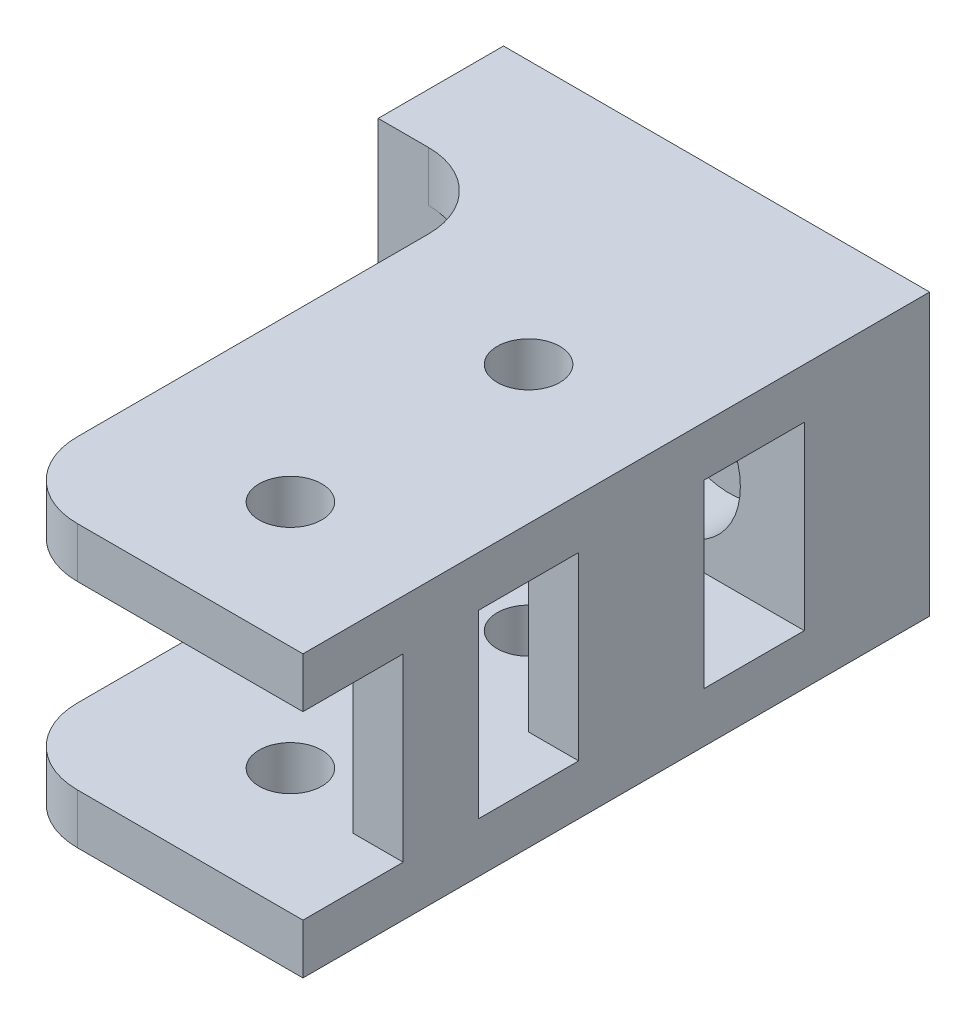
ISO-10303-21;
HEADER;
FILE_DESCRIPTION(('STEP AP214'),'2;1');
FILE_NAME('part.step','',(''),(''),'','','');
FILE_SCHEMA(('AUTOMOTIVE_DESIGN { 1 0 10303 214 1 1 1 1 }'));
ENDSEC;
DATA;
#1=APPLICATION_CONTEXT('core data for automotive mechanical design processes');
#2=APPLICATION_PROTOCOL_DEFINITION('international standard','automotive_design',2000,#1);
#3=PRODUCT_CONTEXT('',#1,'mechanical');
#4=PRODUCT('Part','Part','',(#3));
#5=PRODUCT_RELATED_PRODUCT_CATEGORY('part','',(#4));
#6=PRODUCT_DEFINITION_FORMATION('','',#4);
#7=PRODUCT_DEFINITION_CONTEXT('part definition',#1,'design');
#8=PRODUCT_DEFINITION('design','',#6,#7);
#9=PRODUCT_DEFINITION_SHAPE('','',#8);
#10=(LENGTH_UNIT() NAMED_UNIT(*) SI_UNIT(.MILLI.,.METRE.));
#11=(NAMED_UNIT(*) PLANE_ANGLE_UNIT() SI_UNIT($,.RADIAN.));
#12=(NAMED_UNIT(*) SI_UNIT($,.STERADIAN.) SOLID_ANGLE_UNIT());
#13=UNCERTAINTY_MEASURE_WITH_UNIT(LENGTH_MEASURE(1.E-05),#10,'distance_accuracy_value','');
#14=(GEOMETRIC_REPRESENTATION_CONTEXT(3) GLOBAL_UNCERTAINTY_ASSIGNED_CONTEXT((#13)) GLOBAL_UNIT_ASSIGNED_CONTEXT((#10,
#11,#12)) REPRESENTATION_CONTEXT('',''));
#15=CARTESIAN_POINT('',(0.,0.,0.));
#16=DIRECTION('',(0.,0.,1.));
#17=DIRECTION('',(1.,0.,0.));
#18=AXIS2_PLACEMENT_3D('',#15,#16,#17);
#19=CARTESIAN_POINT('',(11.4991666087883,-5.5,5.));
#20=DIRECTION('',(0.,0.,-1.));
#21=DIRECTION('',(-1.,0.,0.));
#22=AXIS2_PLACEMENT_3D('',#19,#20,#21);
#23=CYLINDRICAL_SURFACE('',#22,1.75);
#24=CARTESIAN_POINT('',(11.4991666087883,-5.5,0.));
#25=DIRECTION('',(0.,0.,1.));
#26=DIRECTION('',(1.,0.,0.));
#27=AXIS2_PLACEMENT_3D('',#24,#25,#26);
#28=CIRCLE('',#27,1.75);
#29=CARTESIAN_POINT('',(13.2491666087883,-5.5,0.));
#30=VERTEX_POINT('',#29);
#31=EDGE_CURVE('E382',#30,#30,#28,.T.);
#32=ORIENTED_EDGE('',*,*,#31,.F.);
#33=EDGE_LOOP('',(#32));
#34=FACE_BOUND('',#33,.T.);
#35=CARTESIAN_POINT('',(11.4991666087883,-5.5,2.5));
#36=DIRECTION('',(0.,0.,1.));
#37=DIRECTION('',(1.,0.,0.));
#38=AXIS2_PLACEMENT_3D('',#35,#36,#37);
#39=CIRCLE('',#38,1.75);
#40=CARTESIAN_POINT('',(13.2491666087883,-5.5,2.5));
#41=VERTEX_POINT('',#40);
#42=EDGE_CURVE('E234',#41,#41,#39,.T.);
#43=ORIENTED_EDGE('',*,*,#42,.T.);
#44=EDGE_LOOP('',(#43));
#45=FACE_BOUND('',#44,.T.);
#46=ADVANCED_FACE('F37',(#34,#45),#23,.F.);
#47=CARTESIAN_POINT('',(5.5,-5.6,5.));
#48=DIRECTION('',(0.,0.,-1.));
#49=DIRECTION('',(-1.,0.,0.));
#50=AXIS2_PLACEMENT_3D('',#47,#48,#49);
#51=CYLINDRICAL_SURFACE('',#50,1.75);
#52=CARTESIAN_POINT('',(5.5,-5.6,0.));
#53=DIRECTION('',(0.,0.,1.));
#54=DIRECTION('',(1.,0.,0.));
#55=AXIS2_PLACEMENT_3D('',#52,#53,#54);
#56=CIRCLE('',#55,1.75);
#57=CARTESIAN_POINT('',(7.25,-5.6,0.));
#58=VERTEX_POINT('',#57);
#59=EDGE_CURVE('E385',#58,#58,#56,.T.);
#60=ORIENTED_EDGE('',*,*,#59,.F.);
#61=EDGE_LOOP('',(#60));
#62=FACE_BOUND('',#61,.T.);
#63=CARTESIAN_POINT('',(5.5,-5.6,2.5));
#64=DIRECTION('',(0.,0.,1.));
#65=DIRECTION('',(1.,0.,0.));
#66=AXIS2_PLACEMENT_3D('',#63,#64,#65);
#67=CIRCLE('',#66,1.75);
#68=CARTESIAN_POINT('',(7.25,-5.6,2.5));
#69=VERTEX_POINT('',#68);
#70=EDGE_CURVE('E205',#69,#69,#67,.T.);
#71=ORIENTED_EDGE('',*,*,#70,.T.);
#72=EDGE_LOOP('',(#71));
#73=FACE_BOUND('',#72,.T.);
#74=ADVANCED_FACE('F471',(#62,#73),#51,.F.);
#75=CARTESIAN_POINT('',(14.9991666087883,0.,25.));
#76=DIRECTION('',(-1.,0.,0.));
#77=DIRECTION('',(0.,0.,1.));
#78=AXIS2_PLACEMENT_3D('',#75,#76,#77);
#79=PLANE('',#78);
#80=DIRECTION('',(0.,-1.,0.));
#81=VECTOR('',#80,1.);
#82=CARTESIAN_POINT('',(14.9991666087883,-2.,21.));
#83=LINE('',#82,#81);
#84=CARTESIAN_POINT('',(14.9991666087883,-2.,21.));
#85=VERTEX_POINT('',#84);
#86=CARTESIAN_POINT('',(14.9991666087883,-9.2,21.));
#87=VERTEX_POINT('',#86);
#88=EDGE_CURVE('E298',#85,#87,#83,.T.);
#89=ORIENTED_EDGE('',*,*,#88,.F.);
#90=DIRECTION('',(0.,0.,-1.));
#91=VECTOR('',#90,1.);
#92=CARTESIAN_POINT('',(14.9991666087883,-2.,25.));
#93=LINE('',#92,#91);
#94=CARTESIAN_POINT('',(14.9991666087883,-2.,18.));
#95=VERTEX_POINT('',#94);
#96=EDGE_CURVE('E381',#85,#95,#93,.T.);
#97=ORIENTED_EDGE('',*,*,#96,.T.);
#98=DIRECTION('',(0.,1.,0.));
#99=VECTOR('',#98,1.);
#100=CARTESIAN_POINT('',(14.9991666087883,-2.,18.));
#101=LINE('',#100,#99);
#102=CARTESIAN_POINT('',(14.9991666087883,-9.2,18.));
#103=VERTEX_POINT('',#102);
#104=EDGE_CURVE('E297',#103,#95,#101,.T.);
#105=ORIENTED_EDGE('',*,*,#104,.F.);
#106=DIRECTION('',(0.,0.,-1.));
#107=VECTOR('',#106,1.);
#108=CARTESIAN_POINT('',(14.9991666087883,-9.2,25.));
#109=LINE('',#108,#107);
#110=EDGE_CURVE('E378',#87,#103,#109,.T.);
#111=ORIENTED_EDGE('',*,*,#110,.F.);
#112=EDGE_LOOP('',(#89,#97,#105,#111));
#113=FACE_BOUND('',#112,.T.);
#114=ADVANCED_FACE('F477',(#113),#79,.T.);
#115=CARTESIAN_POINT('',(0.,0.,25.));
#116=DIRECTION('',(0.,0.,1.));
#117=DIRECTION('',(1.,0.,0.));
#118=AXIS2_PLACEMENT_3D('',#115,#116,#117);
#119=PLANE('',#118);
#120=DIRECTION('',(-1.,0.,0.));
#121=VECTOR('',#120,1.);
#122=CARTESIAN_POINT('',(0.,0.,25.));
#123=LINE('',#122,#121);
#124=CARTESIAN_POINT('',(16.9991666087883,0.,25.));
#125=VERTEX_POINT('',#124);
#126=CARTESIAN_POINT('',(7.99916660878826,0.,25.));
#127=VERTEX_POINT('',#126);
#128=EDGE_CURVE('E363',#125,#127,#123,.T.);
#129=ORIENTED_EDGE('',*,*,#128,.T.);
#130=DIRECTION('',(0.,-1.,0.));
#131=VECTOR('',#130,1.);
#132=CARTESIAN_POINT('',(7.99916660878826,-2.,25.));
#133=LINE('',#132,#131);
#134=CARTESIAN_POINT('',(7.99916660878826,-2.,25.));
#135=VERTEX_POINT('',#134);
#136=EDGE_CURVE('E211',#127,#135,#133,.T.);
#137=ORIENTED_EDGE('',*,*,#136,.T.);
#138=DIRECTION('',(1.,0.,0.));
#139=VECTOR('',#138,1.);
#140=CARTESIAN_POINT('',(0.,-2.,25.));
#141=LINE('',#140,#139);
#142=CARTESIAN_POINT('',(16.9991666087883,-2.,25.));
#143=VERTEX_POINT('',#142);
#144=EDGE_CURVE('E367',#135,#143,#141,.T.);
#145=ORIENTED_EDGE('',*,*,#144,.T.);
#146=DIRECTION('',(0.,1.,0.));
#147=VECTOR('',#146,1.);
#148=CARTESIAN_POINT('',(16.9991666087883,0.,25.));
#149=LINE('',#148,#147);
#150=EDGE_CURVE('E364',#143,#125,#149,.T.);
#151=ORIENTED_EDGE('',*,*,#150,.T.);
#152=EDGE_LOOP('',(#129,#137,#145,#151));
#153=FACE_BOUND('',#152,.T.);
#154=ADVANCED_FACE('F450',(#153),#119,.T.);
#155=CARTESIAN_POINT('',(0.,0.,5.));
#156=DIRECTION('',(0.,0.,1.));
#157=DIRECTION('',(1.,0.,0.));
#158=AXIS2_PLACEMENT_3D('',#155,#156,#157);
#159=PLANE('',#158);
#160=CARTESIAN_POINT('',(11.4991666087883,-5.5,5.));
#161=DIRECTION('',(0.,0.,1.));
#162=DIRECTION('',(1.,0.,0.));
#163=AXIS2_PLACEMENT_3D('',#160,#161,#162);
#164=CIRCLE('',#163,2.95);
#165=CARTESIAN_POINT('',(14.4491666087883,-5.5,5.));
#166=VERTEX_POINT('',#165);
#167=EDGE_CURVE('E433',#166,#166,#164,.T.);
#168=ORIENTED_EDGE('',*,*,#167,.F.);
#169=EDGE_LOOP('',(#168));
#170=FACE_BOUND('',#169,.T.);
#171=CARTESIAN_POINT('',(5.5,-5.6,5.));
#172=DIRECTION('',(0.,0.,1.));
#173=DIRECTION('',(1.,0.,0.));
#174=AXIS2_PLACEMENT_3D('',#171,#172,#173);
#175=CIRCLE('',#174,2.95);
#176=CARTESIAN_POINT('',(8.45,-5.6,5.));
#177=VERTEX_POINT('',#176);
#178=EDGE_CURVE('E236',#177,#177,#175,.T.);
#179=ORIENTED_EDGE('',*,*,#178,.F.);
#180=EDGE_LOOP('',(#179));
#181=FACE_BOUND('',#180,.T.);
#182=DIRECTION('',(1.,0.,0.));
#183=VECTOR('',#182,1.);
#184=CARTESIAN_POINT('',(0.,-11.2,5.));
#185=LINE('',#184,#183);
#186=CARTESIAN_POINT('',(0.,-11.2,5.));
#187=VERTEX_POINT('',#186);
#188=CARTESIAN_POINT('',(1.99916660878826,-11.2,5.));
#189=VERTEX_POINT('',#188);
#190=EDGE_CURVE('E187',#187,#189,#185,.T.);
#191=ORIENTED_EDGE('',*,*,#190,.T.);
#192=DIRECTION('',(0.,-1.,0.));
#193=VECTOR('',#192,1.);
#194=CARTESIAN_POINT('',(1.99916660878826,0.,5.));
#195=LINE('',#194,#193);
#196=CARTESIAN_POINT('',(1.99916660878826,-9.2,5.));
#197=VERTEX_POINT('',#196);
#198=EDGE_CURVE('E261',#189,#197,#195,.F.);
#199=ORIENTED_EDGE('',*,*,#198,.T.);
#200=DIRECTION('',(-1.,0.,0.));
#201=VECTOR('',#200,1.);
#202=CARTESIAN_POINT('',(0.,-9.2,5.));
#203=LINE('',#202,#201);
#204=CARTESIAN_POINT('',(16.9991666087883,-9.2,5.));
#205=VERTEX_POINT('',#204);
#206=EDGE_CURVE('E52',#205,#197,#203,.T.);
#207=ORIENTED_EDGE('',*,*,#206,.F.);
#208=DIRECTION('',(0.,-1.,0.));
#209=VECTOR('',#208,1.);
#210=CARTESIAN_POINT('',(16.9991666087883,0.,5.));
#211=LINE('',#210,#209);
#212=CARTESIAN_POINT('',(16.9991666087883,-2.,5.));
#213=VERTEX_POINT('',#212);
#214=EDGE_CURVE('E357',#213,#205,#211,.T.);
#215=ORIENTED_EDGE('',*,*,#214,.F.);
#216=DIRECTION('',(1.,0.,0.));
#217=VECTOR('',#216,1.);
#218=CARTESIAN_POINT('',(0.,-2.,5.));
#219=LINE('',#218,#217);
#220=CARTESIAN_POINT('',(1.99916660878826,-2.,5.));
#221=VERTEX_POINT('',#220);
#222=EDGE_CURVE('E60',#221,#213,#219,.T.);
#223=ORIENTED_EDGE('',*,*,#222,.F.);
#224=DIRECTION('',(0.,-1.,0.));
#225=VECTOR('',#224,1.);
#226=CARTESIAN_POINT('',(1.99916660878826,0.,5.));
#227=LINE('',#226,#225);
#228=CARTESIAN_POINT('',(1.99916660878826,0.,5.));
#229=VERTEX_POINT('',#228);
#230=EDGE_CURVE('E259',#221,#229,#227,.F.);
#231=ORIENTED_EDGE('',*,*,#230,.T.);
#232=DIRECTION('',(1.,0.,0.));
#233=VECTOR('',#232,1.);
#234=CARTESIAN_POINT('',(0.,0.,5.));
#235=LINE('',#234,#233);
#236=CARTESIAN_POINT('',(0.,0.,5.));
#237=VERTEX_POINT('',#236);
#238=EDGE_CURVE('E190',#237,#229,#235,.T.);
#239=ORIENTED_EDGE('',*,*,#238,.F.);
#240=DIRECTION('',(0.,-1.,0.));
#241=VECTOR('',#240,1.);
#242=CARTESIAN_POINT('',(0.,0.,5.));
#243=LINE('',#242,#241);
#244=EDGE_CURVE('E184',#237,#187,#243,.T.);
#245=ORIENTED_EDGE('',*,*,#244,.T.);
#246=EDGE_LOOP('',(#191,#199,#207,#215,#223,#231,#239,#245));
#247=FACE_BOUND('',#246,.T.);
#248=ADVANCED_FACE('F186',(#170,#181,#247),#159,.T.);
#249=CARTESIAN_POINT('',(0.,0.,0.));
#250=DIRECTION('',(0.,0.,1.));
#251=DIRECTION('',(1.,0.,0.));
#252=AXIS2_PLACEMENT_3D('',#249,#250,#251);
#253=PLANE('',#252);
#254=DIRECTION('',(0.,-1.,0.));
#255=VECTOR('',#254,1.);
#256=CARTESIAN_POINT('',(0.,0.,0.));
#257=LINE('',#256,#255);
#258=CARTESIAN_POINT('',(0.,0.,0.));
#259=VERTEX_POINT('',#258);
#260=CARTESIAN_POINT('',(0.,-11.2,0.));
#261=VERTEX_POINT('',#260);
#262=EDGE_CURVE('E210',#259,#261,#257,.T.);
#263=ORIENTED_EDGE('',*,*,#262,.F.);
#264=DIRECTION('',(-1.,0.,0.));
#265=VECTOR('',#264,1.);
#266=CARTESIAN_POINT('',(0.,0.,0.));
#267=LINE('',#266,#265);
#268=CARTESIAN_POINT('',(16.9991666087883,0.,0.));
#269=VERTEX_POINT('',#268);
#270=EDGE_CURVE('E195',#269,#259,#267,.T.);
#271=ORIENTED_EDGE('',*,*,#270,.F.);
#272=DIRECTION('',(0.,1.,0.));
#273=VECTOR('',#272,1.);
#274=CARTESIAN_POINT('',(16.9991666087883,0.,0.));
#275=LINE('',#274,#273);
#276=CARTESIAN_POINT('',(16.9991666087883,-11.2,0.));
#277=VERTEX_POINT('',#276);
#278=EDGE_CURVE('E391',#277,#269,#275,.T.);
#279=ORIENTED_EDGE('',*,*,#278,.F.);
#280=DIRECTION('',(1.,0.,0.));
#281=VECTOR('',#280,1.);
#282=CARTESIAN_POINT('',(0.,-11.2,0.));
#283=LINE('',#282,#281);
#284=EDGE_CURVE('E389',#261,#277,#283,.T.);
#285=ORIENTED_EDGE('',*,*,#284,.F.);
#286=EDGE_LOOP('',(#263,#271,#279,#285));
#287=FACE_BOUND('',#286,.T.);
#288=ORIENTED_EDGE('',*,*,#59,.T.);
#289=EDGE_LOOP('',(#288));
#290=FACE_BOUND('',#289,.T.);
#291=ORIENTED_EDGE('',*,*,#31,.T.);
#292=EDGE_LOOP('',(#291));
#293=FACE_BOUND('',#292,.T.);
#294=ADVANCED_FACE('F402',(#287,#290,#293),#253,.F.);
#295=CARTESIAN_POINT('',(0.,0.,5.));
#296=DIRECTION('',(1.,0.,0.));
#297=DIRECTION('',(0.,1.,0.));
#298=AXIS2_PLACEMENT_3D('',#295,#296,#297);
#299=PLANE('',#298);
#300=DIRECTION('',(0.,0.,-1.));
#301=VECTOR('',#300,1.);
#302=CARTESIAN_POINT('',(0.,-11.2,5.));
#303=LINE('',#302,#301);
#304=EDGE_CURVE('E200',#187,#261,#303,.T.);
#305=ORIENTED_EDGE('',*,*,#304,.F.);
#306=ORIENTED_EDGE('',*,*,#244,.F.);
#307=DIRECTION('',(0.,0.,-1.));
#308=VECTOR('',#307,1.);
#309=CARTESIAN_POINT('',(0.,0.,5.));
#310=LINE('',#309,#308);
#311=EDGE_CURVE('E194',#237,#259,#310,.T.);
#312=ORIENTED_EDGE('',*,*,#311,.T.);
#313=ORIENTED_EDGE('',*,*,#262,.T.);
#314=EDGE_LOOP('',(#305,#306,#312,#313));
#315=FACE_BOUND('',#314,.T.);
#316=ADVANCED_FACE('F208',(#315),#299,.F.);
#317=CARTESIAN_POINT('',(0.,-11.2,5.));
#318=DIRECTION('',(0.,1.,0.));
#319=DIRECTION('',(0.,0.,1.));
#320=AXIS2_PLACEMENT_3D('',#317,#318,#319);
#321=PLANE('',#320);
#322=CARTESIAN_POINT('',(11.4991666087883,-11.2,10.5));
#323=DIRECTION('',(0.,-1.,0.));
#324=DIRECTION('',(0.,0.,-1.));
#325=AXIS2_PLACEMENT_3D('',#322,#323,#324);
#326=CIRCLE('',#325,1.25);
#327=CARTESIAN_POINT('',(11.4991666087883,-11.2,9.25));
#328=VERTEX_POINT('',#327);
#329=EDGE_CURVE('E423',#328,#328,#326,.T.);
#330=ORIENTED_EDGE('',*,*,#329,.F.);
#331=EDGE_LOOP('',(#330));
#332=FACE_BOUND('',#331,.T.);
#333=CARTESIAN_POINT('',(11.4991666087883,-11.2,20.));
#334=DIRECTION('',(0.,-1.,0.));
#335=DIRECTION('',(0.,0.,-1.));
#336=AXIS2_PLACEMENT_3D('',#333,#334,#335);
#337=CIRCLE('',#336,1.25);
#338=CARTESIAN_POINT('',(11.4991666087883,-11.2,18.75));
#339=VERTEX_POINT('',#338);
#340=EDGE_CURVE('E226',#339,#339,#337,.T.);
#341=ORIENTED_EDGE('',*,*,#340,.F.);
#342=EDGE_LOOP('',(#341));
#343=FACE_BOUND('',#342,.T.);
#344=DIRECTION('',(1.,0.,0.));
#345=VECTOR('',#344,1.);
#346=CARTESIAN_POINT('',(0.,-11.2,25.));
#347=LINE('',#346,#345);
#348=CARTESIAN_POINT('',(7.99916660878826,-11.2,25.));
#349=VERTEX_POINT('',#348);
#350=CARTESIAN_POINT('',(16.9991666087883,-11.2,25.));
#351=VERTEX_POINT('',#350);
#352=EDGE_CURVE('E372',#349,#351,#347,.T.);
#353=ORIENTED_EDGE('',*,*,#352,.F.);
#354=CARTESIAN_POINT('',(7.99916660878826,-11.2,22.));
#355=DIRECTION('',(0.,1.,0.));
#356=DIRECTION('',(0.,0.,1.));
#357=AXIS2_PLACEMENT_3D('',#354,#355,#356);
#358=CIRCLE('',#357,3.);
#359=CARTESIAN_POINT('',(4.99916660878826,-11.2,22.));
#360=VERTEX_POINT('',#359);
#361=EDGE_CURVE('E257',#349,#360,#358,.F.);
#362=ORIENTED_EDGE('',*,*,#361,.T.);
#363=DIRECTION('',(0.,0.,1.));
#364=VECTOR('',#363,1.);
#365=CARTESIAN_POINT('',(4.99916660878826,-11.2,5.));
#366=LINE('',#365,#364);
#367=CARTESIAN_POINT('',(4.99916660878826,-11.2,8.));
#368=VERTEX_POINT('',#367);
#369=EDGE_CURVE('E204',#368,#360,#366,.T.);
#370=ORIENTED_EDGE('',*,*,#369,.F.);
#371=CARTESIAN_POINT('',(1.99916660878826,-11.2,8.));
#372=DIRECTION('',(0.,1.,0.));
#373=DIRECTION('',(0.,0.,1.));
#374=AXIS2_PLACEMENT_3D('',#371,#372,#373);
#375=CIRCLE('',#374,3.);
#376=EDGE_CURVE('E203',#368,#189,#375,.T.);
#377=ORIENTED_EDGE('',*,*,#376,.T.);
#378=ORIENTED_EDGE('',*,*,#190,.F.);
#379=ORIENTED_EDGE('',*,*,#304,.T.);
#380=ORIENTED_EDGE('',*,*,#284,.T.);
#381=DIRECTION('',(0.,0.,-1.));
#382=VECTOR('',#381,1.);
#383=CARTESIAN_POINT('',(16.9991666087883,-11.2,5.));
#384=LINE('',#383,#382);
#385=EDGE_CURVE('E212',#351,#277,#384,.T.);
#386=ORIENTED_EDGE('',*,*,#385,.F.);
#387=EDGE_LOOP('',(#353,#362,#370,#377,#378,#379,#380,#386));
#388=FACE_BOUND('',#387,.T.);
#389=ADVANCED_FACE('F199',(#332,#343,#388),#321,.F.);
#390=CARTESIAN_POINT('',(16.9991666087883,0.,5.));
#391=DIRECTION('',(-1.,0.,0.));
#392=DIRECTION('',(0.,0.,1.));
#393=AXIS2_PLACEMENT_3D('',#390,#391,#392);
#394=PLANE('',#393);
#395=DIRECTION('',(0.,0.,1.));
#396=VECTOR('',#395,1.);
#397=CARTESIAN_POINT('',(16.9991666087883,-9.2,5.));
#398=LINE('',#397,#396);
#399=CARTESIAN_POINT('',(16.9991666087883,-9.2,14.));
#400=VERTEX_POINT('',#399);
#401=CARTESIAN_POINT('',(16.9991666087883,-9.2,18.));
#402=VERTEX_POINT('',#401);
#403=EDGE_CURVE('E336',#400,#402,#398,.T.);
#404=ORIENTED_EDGE('',*,*,#403,.T.);
#405=DIRECTION('',(0.,1.,0.));
#406=VECTOR('',#405,1.);
#407=CARTESIAN_POINT('',(16.9991666087883,0.,18.));
#408=LINE('',#407,#406);
#409=CARTESIAN_POINT('',(16.9991666087883,-2.,18.));
#410=VERTEX_POINT('',#409);
#411=EDGE_CURVE('E327',#402,#410,#408,.T.);
#412=ORIENTED_EDGE('',*,*,#411,.T.);
#413=DIRECTION('',(0.,0.,-1.));
#414=VECTOR('',#413,1.);
#415=CARTESIAN_POINT('',(16.9991666087883,-2.,5.));
#416=LINE('',#415,#414);
#417=CARTESIAN_POINT('',(16.9991666087883,-2.,14.));
#418=VERTEX_POINT('',#417);
#419=EDGE_CURVE('E333',#410,#418,#416,.T.);
#420=ORIENTED_EDGE('',*,*,#419,.T.);
#421=DIRECTION('',(0.,-1.,0.));
#422=VECTOR('',#421,1.);
#423=CARTESIAN_POINT('',(16.9991666087883,0.,14.));
#424=LINE('',#423,#422);
#425=EDGE_CURVE('E324',#418,#400,#424,.T.);
#426=ORIENTED_EDGE('',*,*,#425,.T.);
#427=EDGE_LOOP('',(#404,#412,#420,#426));
#428=FACE_BOUND('',#427,.T.);
#429=DIRECTION('',(0.,0.,-1.));
#430=VECTOR('',#429,1.);
#431=CARTESIAN_POINT('',(16.9991666087883,-2.,5.));
#432=LINE('',#431,#430);
#433=CARTESIAN_POINT('',(16.9991666087883,-2.,9.));
#434=VERTEX_POINT('',#433);
#435=EDGE_CURVE('E354',#434,#213,#432,.T.);
#436=ORIENTED_EDGE('',*,*,#435,.T.);
#437=ORIENTED_EDGE('',*,*,#214,.T.);
#438=DIRECTION('',(0.,0.,1.));
#439=VECTOR('',#438,1.);
#440=CARTESIAN_POINT('',(16.9991666087883,-9.2,5.));
#441=LINE('',#440,#439);
#442=CARTESIAN_POINT('',(16.9991666087883,-9.2,9.));
#443=VERTEX_POINT('',#442);
#444=EDGE_CURVE('E346',#205,#443,#441,.T.);
#445=ORIENTED_EDGE('',*,*,#444,.T.);
#446=DIRECTION('',(0.,1.,0.));
#447=VECTOR('',#446,1.);
#448=CARTESIAN_POINT('',(16.9991666087883,0.,9.));
#449=LINE('',#448,#447);
#450=EDGE_CURVE('E351',#443,#434,#449,.T.);
#451=ORIENTED_EDGE('',*,*,#450,.T.);
#452=EDGE_LOOP('',(#436,#437,#445,#451));
#453=FACE_BOUND('',#452,.T.);
#454=ORIENTED_EDGE('',*,*,#150,.F.);
#455=DIRECTION('',(0.,0.,-1.));
#456=VECTOR('',#455,1.);
#457=CARTESIAN_POINT('',(16.9991666087883,-2.,5.));
#458=LINE('',#457,#456);
#459=CARTESIAN_POINT('',(16.9991666087883,-2.,21.));
#460=VERTEX_POINT('',#459);
#461=EDGE_CURVE('E321',#143,#460,#458,.T.);
#462=ORIENTED_EDGE('',*,*,#461,.T.);
#463=DIRECTION('',(0.,-1.,0.));
#464=VECTOR('',#463,1.);
#465=CARTESIAN_POINT('',(16.9991666087883,0.,21.));
#466=LINE('',#465,#464);
#467=CARTESIAN_POINT('',(16.9991666087883,-9.2,21.));
#468=VERTEX_POINT('',#467);
#469=EDGE_CURVE('E330',#460,#468,#466,.T.);
#470=ORIENTED_EDGE('',*,*,#469,.T.);
#471=DIRECTION('',(0.,0.,1.));
#472=VECTOR('',#471,1.);
#473=CARTESIAN_POINT('',(16.9991666087883,-9.2,5.));
#474=LINE('',#473,#472);
#475=CARTESIAN_POINT('',(16.9991666087883,-9.2,25.));
#476=VERTEX_POINT('',#475);
#477=EDGE_CURVE('E305',#468,#476,#474,.T.);
#478=ORIENTED_EDGE('',*,*,#477,.T.);
#479=EDGE_CURVE('E360',#351,#476,#149,.T.);
#480=ORIENTED_EDGE('',*,*,#479,.F.);
#481=ORIENTED_EDGE('',*,*,#385,.T.);
#482=ORIENTED_EDGE('',*,*,#278,.T.);
#483=DIRECTION('',(0.,0.,-1.));
#484=VECTOR('',#483,1.);
#485=CARTESIAN_POINT('',(16.9991666087883,0.,5.));
#486=LINE('',#485,#484);
#487=EDGE_CURVE('E218',#125,#269,#486,.T.);
#488=ORIENTED_EDGE('',*,*,#487,.F.);
#489=EDGE_LOOP('',(#454,#462,#470,#478,#480,#481,#482,#488));
#490=FACE_BOUND('',#489,.T.);
#491=ADVANCED_FACE('F406',(#428,#453,#490),#394,.F.);
#492=CARTESIAN_POINT('',(0.,0.,5.));
#493=DIRECTION('',(0.,-1.,0.));
#494=DIRECTION('',(1.,0.,0.));
#495=AXIS2_PLACEMENT_3D('',#492,#493,#494);
#496=PLANE('',#495);
#497=CARTESIAN_POINT('',(11.4991666087883,0.,10.5));
#498=DIRECTION('',(0.,-1.,0.));
#499=DIRECTION('',(1.,0.,0.));
#500=AXIS2_PLACEMENT_3D('',#497,#498,#499);
#501=CIRCLE('',#500,1.25);
#502=CARTESIAN_POINT('',(12.7491666087883,0.,10.5));
#503=VERTEX_POINT('',#502);
#504=EDGE_CURVE('E287',#503,#503,#501,.T.);
#505=ORIENTED_EDGE('',*,*,#504,.T.);
#506=EDGE_LOOP('',(#505));
#507=FACE_BOUND('',#506,.T.);
#508=CARTESIAN_POINT('',(11.4991666087883,0.,20.));
#509=DIRECTION('',(0.,-1.,0.));
#510=DIRECTION('',(1.,0.,0.));
#511=AXIS2_PLACEMENT_3D('',#508,#509,#510);
#512=CIRCLE('',#511,1.25);
#513=CARTESIAN_POINT('',(12.7491666087883,0.,20.));
#514=VERTEX_POINT('',#513);
#515=EDGE_CURVE('E294',#514,#514,#512,.T.);
#516=ORIENTED_EDGE('',*,*,#515,.T.);
#517=EDGE_LOOP('',(#516));
#518=FACE_BOUND('',#517,.T.);
#519=DIRECTION('',(0.,0.,1.));
#520=VECTOR('',#519,1.);
#521=CARTESIAN_POINT('',(4.99916660878826,0.,5.));
#522=LINE('',#521,#520);
#523=CARTESIAN_POINT('',(4.99916660878826,0.,8.));
#524=VERTEX_POINT('',#523);
#525=CARTESIAN_POINT('',(4.99916660878826,0.,22.));
#526=VERTEX_POINT('',#525);
#527=EDGE_CURVE('E280',#524,#526,#522,.T.);
#528=ORIENTED_EDGE('',*,*,#527,.T.);
#529=CARTESIAN_POINT('',(7.99916660878826,0.,22.));
#530=DIRECTION('',(0.,-1.,0.));
#531=DIRECTION('',(1.,0.,0.));
#532=AXIS2_PLACEMENT_3D('',#529,#530,#531);
#533=CIRCLE('',#532,3.);
#534=EDGE_CURVE('E245',#526,#127,#533,.F.);
#535=ORIENTED_EDGE('',*,*,#534,.T.);
#536=ORIENTED_EDGE('',*,*,#128,.F.);
#537=ORIENTED_EDGE('',*,*,#487,.T.);
#538=ORIENTED_EDGE('',*,*,#270,.T.);
#539=ORIENTED_EDGE('',*,*,#311,.F.);
#540=ORIENTED_EDGE('',*,*,#238,.T.);
#541=CARTESIAN_POINT('',(1.99916660878826,0.,8.));
#542=DIRECTION('',(0.,-1.,0.));
#543=DIRECTION('',(1.,0.,0.));
#544=AXIS2_PLACEMENT_3D('',#541,#542,#543);
#545=CIRCLE('',#544,3.);
#546=EDGE_CURVE('E11',#229,#524,#545,.T.);
#547=ORIENTED_EDGE('',*,*,#546,.T.);
#548=EDGE_LOOP('',(#528,#535,#536,#537,#538,#539,#540,#547));
#549=FACE_BOUND('',#548,.T.);
#550=ADVANCED_FACE('F277',(#507,#518,#549),#496,.F.);
#551=CARTESIAN_POINT('',(0.,-2.,25.));
#552=DIRECTION('',(0.,1.,0.));
#553=DIRECTION('',(-1.,0.,0.));
#554=AXIS2_PLACEMENT_3D('',#551,#552,#553);
#555=PLANE('',#554);
#556=CARTESIAN_POINT('',(11.4991666087883,-2.,10.5));
#557=DIRECTION('',(0.,1.,0.));
#558=DIRECTION('',(-1.,0.,0.));
#559=AXIS2_PLACEMENT_3D('',#556,#557,#558);
#560=CIRCLE('',#559,1.25);
#561=CARTESIAN_POINT('',(10.2491666087883,-2.,10.5));
#562=VERTEX_POINT('',#561);
#563=EDGE_CURVE('E230',#562,#562,#560,.T.);
#564=ORIENTED_EDGE('',*,*,#563,.T.);
#565=EDGE_LOOP('',(#564));
#566=FACE_BOUND('',#565,.T.);
#567=CARTESIAN_POINT('',(11.4991666087883,-2.,20.));
#568=DIRECTION('',(0.,1.,0.));
#569=DIRECTION('',(-1.,0.,0.));
#570=AXIS2_PLACEMENT_3D('',#567,#568,#569);
#571=CIRCLE('',#570,1.25);
#572=CARTESIAN_POINT('',(10.2491666087883,-2.,20.));
#573=VERTEX_POINT('',#572);
#574=EDGE_CURVE('E225',#573,#573,#571,.T.);
#575=ORIENTED_EDGE('',*,*,#574,.T.);
#576=EDGE_LOOP('',(#575));
#577=FACE_BOUND('',#576,.T.);
#578=ORIENTED_EDGE('',*,*,#144,.F.);
#579=CARTESIAN_POINT('',(7.99916660878826,-2.,22.));
#580=DIRECTION('',(0.,1.,0.));
#581=DIRECTION('',(-1.,0.,0.));
#582=AXIS2_PLACEMENT_3D('',#579,#580,#581);
#583=CIRCLE('',#582,3.);
#584=CARTESIAN_POINT('',(4.99916660878826,-2.,22.));
#585=VERTEX_POINT('',#584);
#586=EDGE_CURVE('E215',#135,#585,#583,.F.);
#587=ORIENTED_EDGE('',*,*,#586,.T.);
#588=DIRECTION('',(0.,0.,-1.));
#589=VECTOR('',#588,1.);
#590=CARTESIAN_POINT('',(4.99916660878826,-2.,25.));
#591=LINE('',#590,#589);
#592=CARTESIAN_POINT('',(4.99916660878826,-2.,8.));
#593=VERTEX_POINT('',#592);
#594=EDGE_CURVE('E271',#585,#593,#591,.T.);
#595=ORIENTED_EDGE('',*,*,#594,.T.);
#596=CARTESIAN_POINT('',(1.99916660878826,-2.,8.));
#597=DIRECTION('',(0.,1.,0.));
#598=DIRECTION('',(-1.,0.,0.));
#599=AXIS2_PLACEMENT_3D('',#596,#597,#598);
#600=CIRCLE('',#599,3.);
#601=EDGE_CURVE('E45',#593,#221,#600,.T.);
#602=ORIENTED_EDGE('',*,*,#601,.T.);
#603=ORIENTED_EDGE('',*,*,#222,.T.);
#604=ORIENTED_EDGE('',*,*,#435,.F.);
#605=DIRECTION('',(-1.,0.,0.));
#606=VECTOR('',#605,1.);
#607=CARTESIAN_POINT('',(34.9991666087883,-1.99999999999999,9.));
#608=LINE('',#607,#606);
#609=CARTESIAN_POINT('',(14.9991666087883,-2.,9.));
#610=VERTEX_POINT('',#609);
#611=EDGE_CURVE('E343',#434,#610,#608,.T.);
#612=ORIENTED_EDGE('',*,*,#611,.T.);
#613=CARTESIAN_POINT('',(14.9991666087883,-2.,14.));
#614=VERTEX_POINT('',#613);
#615=EDGE_CURVE('E379',#614,#610,#93,.T.);
#616=ORIENTED_EDGE('',*,*,#615,.F.);
#617=DIRECTION('',(-1.,0.,0.));
#618=VECTOR('',#617,1.);
#619=CARTESIAN_POINT('',(34.9991666087883,-1.99999999999999,14.));
#620=LINE('',#619,#618);
#621=EDGE_CURVE('E316',#418,#614,#620,.T.);
#622=ORIENTED_EDGE('',*,*,#621,.F.);
#623=ORIENTED_EDGE('',*,*,#419,.F.);
#624=DIRECTION('',(-1.,0.,0.));
#625=VECTOR('',#624,1.);
#626=CARTESIAN_POINT('',(34.9991666087883,-1.99999999999999,18.));
#627=LINE('',#626,#625);
#628=EDGE_CURVE('E311',#410,#95,#627,.T.);
#629=ORIENTED_EDGE('',*,*,#628,.T.);
#630=ORIENTED_EDGE('',*,*,#96,.F.);
#631=DIRECTION('',(-1.,0.,0.));
#632=VECTOR('',#631,1.);
#633=CARTESIAN_POINT('',(34.9991666087883,-1.99999999999999,21.));
#634=LINE('',#633,#632);
#635=EDGE_CURVE('E303',#460,#85,#634,.T.);
#636=ORIENTED_EDGE('',*,*,#635,.F.);
#637=ORIENTED_EDGE('',*,*,#461,.F.);
#638=EDGE_LOOP('',(#578,#587,#595,#602,#603,#604,#612,#616,#622,#623,#629,#630,#636,#637));
#639=FACE_BOUND('',#638,.T.);
#640=ADVANCED_FACE('F269',(#566,#577,#639),#555,.F.);
#641=DIRECTION('',(0.,-1.,0.));
#642=VECTOR('',#641,1.);
#643=CARTESIAN_POINT('',(14.9991666087883,-2.,14.));
#644=LINE('',#643,#642);
#645=CARTESIAN_POINT('',(14.9991666087883,-9.2,14.));
#646=VERTEX_POINT('',#645);
#647=EDGE_CURVE('E309',#614,#646,#644,.T.);
#648=ORIENTED_EDGE('',*,*,#647,.F.);
#649=ORIENTED_EDGE('',*,*,#615,.T.);
#650=DIRECTION('',(0.,1.,0.));
#651=VECTOR('',#650,1.);
#652=CARTESIAN_POINT('',(14.9991666087883,-2.,9.));
#653=LINE('',#652,#651);
#654=CARTESIAN_POINT('',(14.9991666087883,-9.2,9.));
#655=VERTEX_POINT('',#654);
#656=EDGE_CURVE('E339',#655,#610,#653,.T.);
#657=ORIENTED_EDGE('',*,*,#656,.F.);
#658=EDGE_CURVE('E374',#646,#655,#109,.T.);
#659=ORIENTED_EDGE('',*,*,#658,.F.);
#660=EDGE_LOOP('',(#648,#649,#657,#659));
#661=FACE_BOUND('',#660,.T.);
#662=ADVANCED_FACE('F519',(#661),#79,.T.);
#663=CARTESIAN_POINT('',(0.,-9.2,25.));
#664=DIRECTION('',(0.,-1.,0.));
#665=DIRECTION('',(1.,0.,0.));
#666=AXIS2_PLACEMENT_3D('',#663,#664,#665);
#667=PLANE('',#666);
#668=CARTESIAN_POINT('',(11.4991666087883,-9.2,10.5));
#669=DIRECTION('',(0.,-1.,0.));
#670=DIRECTION('',(1.,0.,0.));
#671=AXIS2_PLACEMENT_3D('',#668,#669,#670);
#672=CIRCLE('',#671,1.25);
#673=CARTESIAN_POINT('',(12.7491666087883,-9.2,10.5));
#674=VERTEX_POINT('',#673);
#675=EDGE_CURVE('E227',#674,#674,#672,.T.);
#676=ORIENTED_EDGE('',*,*,#675,.T.);
#677=EDGE_LOOP('',(#676));
#678=FACE_BOUND('',#677,.T.);
#679=CARTESIAN_POINT('',(11.4991666087883,-9.2,20.));
#680=DIRECTION('',(0.,-1.,0.));
#681=DIRECTION('',(1.,0.,0.));
#682=AXIS2_PLACEMENT_3D('',#679,#680,#681);
#683=CIRCLE('',#682,1.25);
#684=CARTESIAN_POINT('',(12.7491666087883,-9.2,20.));
#685=VERTEX_POINT('',#684);
#686=EDGE_CURVE('E222',#685,#685,#683,.T.);
#687=ORIENTED_EDGE('',*,*,#686,.T.);
#688=EDGE_LOOP('',(#687));
#689=FACE_BOUND('',#688,.T.);
#690=DIRECTION('',(0.,0.,1.));
#691=VECTOR('',#690,1.);
#692=CARTESIAN_POINT('',(4.99916660878826,-9.2,25.));
#693=LINE('',#692,#691);
#694=CARTESIAN_POINT('',(4.99916660878826,-9.2,8.));
#695=VERTEX_POINT('',#694);
#696=CARTESIAN_POINT('',(4.99916660878826,-9.2,22.));
#697=VERTEX_POINT('',#696);
#698=EDGE_CURVE('E419',#695,#697,#693,.T.);
#699=ORIENTED_EDGE('',*,*,#698,.T.);
#700=CARTESIAN_POINT('',(7.99916660878826,-9.2,22.));
#701=DIRECTION('',(0.,-1.,0.));
#702=DIRECTION('',(1.,0.,0.));
#703=AXIS2_PLACEMENT_3D('',#700,#701,#702);
#704=CIRCLE('',#703,3.);
#705=CARTESIAN_POINT('',(7.99916660878826,-9.2,25.));
#706=VERTEX_POINT('',#705);
#707=EDGE_CURVE('E253',#697,#706,#704,.F.);
#708=ORIENTED_EDGE('',*,*,#707,.T.);
#709=DIRECTION('',(-1.,0.,0.));
#710=VECTOR('',#709,1.);
#711=CARTESIAN_POINT('',(0.,-9.2,25.));
#712=LINE('',#711,#710);
#713=EDGE_CURVE('E369',#476,#706,#712,.T.);
#714=ORIENTED_EDGE('',*,*,#713,.F.);
#715=ORIENTED_EDGE('',*,*,#477,.F.);
#716=DIRECTION('',(-1.,0.,0.));
#717=VECTOR('',#716,1.);
#718=CARTESIAN_POINT('',(34.9991666087883,-9.19999999999999,21.));
#719=LINE('',#718,#717);
#720=EDGE_CURVE('E301',#468,#87,#719,.T.);
#721=ORIENTED_EDGE('',*,*,#720,.T.);
#722=ORIENTED_EDGE('',*,*,#110,.T.);
#723=DIRECTION('',(-1.,0.,0.));
#724=VECTOR('',#723,1.);
#725=CARTESIAN_POINT('',(34.9991666087883,-9.19999999999999,18.));
#726=LINE('',#725,#724);
#727=EDGE_CURVE('E302',#402,#103,#726,.T.);
#728=ORIENTED_EDGE('',*,*,#727,.F.);
#729=ORIENTED_EDGE('',*,*,#403,.F.);
#730=DIRECTION('',(-1.,0.,0.));
#731=VECTOR('',#730,1.);
#732=CARTESIAN_POINT('',(34.9991666087883,-9.19999999999999,14.));
#733=LINE('',#732,#731);
#734=EDGE_CURVE('E313',#400,#646,#733,.T.);
#735=ORIENTED_EDGE('',*,*,#734,.T.);
#736=ORIENTED_EDGE('',*,*,#658,.T.);
#737=DIRECTION('',(-1.,0.,0.));
#738=VECTOR('',#737,1.);
#739=CARTESIAN_POINT('',(34.9991666087883,-9.19999999999999,9.));
#740=LINE('',#739,#738);
#741=EDGE_CURVE('E342',#443,#655,#740,.T.);
#742=ORIENTED_EDGE('',*,*,#741,.F.);
#743=ORIENTED_EDGE('',*,*,#444,.F.);
#744=ORIENTED_EDGE('',*,*,#206,.T.);
#745=CARTESIAN_POINT('',(1.99916660878826,-9.2,8.));
#746=DIRECTION('',(0.,-1.,0.));
#747=DIRECTION('',(1.,0.,0.));
#748=AXIS2_PLACEMENT_3D('',#745,#746,#747);
#749=CIRCLE('',#748,3.);
#750=EDGE_CURVE('E264',#197,#695,#749,.T.);
#751=ORIENTED_EDGE('',*,*,#750,.T.);
#752=EDGE_LOOP('',(#699,#708,#714,#715,#721,#722,#728,#729,#735,#736,#742,#743,#744,#751));
#753=FACE_BOUND('',#752,.T.);
#754=ADVANCED_FACE('F421',(#678,#689,#753),#667,.F.);
#755=ORIENTED_EDGE('',*,*,#713,.T.);
#756=DIRECTION('',(0.,1.,0.));
#757=VECTOR('',#756,1.);
#758=CARTESIAN_POINT('',(7.99916660878826,-11.2,25.));
#759=LINE('',#758,#757);
#760=EDGE_CURVE('E255',#706,#349,#759,.F.);
#761=ORIENTED_EDGE('',*,*,#760,.T.);
#762=ORIENTED_EDGE('',*,*,#352,.T.);
#763=ORIENTED_EDGE('',*,*,#479,.T.);
#764=EDGE_LOOP('',(#755,#761,#762,#763));
#765=FACE_BOUND('',#764,.T.);
#766=ADVANCED_FACE('F408',(#765),#119,.T.);
#767=CARTESIAN_POINT('',(34.9991666087883,-1.99999999999999,9.));
#768=DIRECTION('',(0.,0.,1.));
#769=DIRECTION('',(1.,0.,0.));
#770=AXIS2_PLACEMENT_3D('',#767,#768,#769);
#771=PLANE('',#770);
#772=ORIENTED_EDGE('',*,*,#741,.T.);
#773=ORIENTED_EDGE('',*,*,#656,.T.);
#774=ORIENTED_EDGE('',*,*,#611,.F.);
#775=ORIENTED_EDGE('',*,*,#450,.F.);
#776=EDGE_LOOP('',(#772,#773,#774,#775));
#777=FACE_BOUND('',#776,.T.);
#778=ADVANCED_FACE('F514',(#777),#771,.F.);
#779=CARTESIAN_POINT('',(34.9991666087883,-1.99999999999999,21.));
#780=DIRECTION('',(0.,0.,-1.));
#781=DIRECTION('',(-1.,0.,0.));
#782=AXIS2_PLACEMENT_3D('',#779,#780,#781);
#783=PLANE('',#782);
#784=ORIENTED_EDGE('',*,*,#635,.T.);
#785=ORIENTED_EDGE('',*,*,#88,.T.);
#786=ORIENTED_EDGE('',*,*,#720,.F.);
#787=ORIENTED_EDGE('',*,*,#469,.F.);
#788=EDGE_LOOP('',(#784,#785,#786,#787));
#789=FACE_BOUND('',#788,.T.);
#790=ADVANCED_FACE('F565',(#789),#783,.F.);
#791=CARTESIAN_POINT('',(34.9991666087883,-1.99999999999999,18.));
#792=DIRECTION('',(0.,0.,1.));
#793=DIRECTION('',(1.,0.,0.));
#794=AXIS2_PLACEMENT_3D('',#791,#792,#793);
#795=PLANE('',#794);
#796=ORIENTED_EDGE('',*,*,#727,.T.);
#797=ORIENTED_EDGE('',*,*,#104,.T.);
#798=ORIENTED_EDGE('',*,*,#628,.F.);
#799=ORIENTED_EDGE('',*,*,#411,.F.);
#800=EDGE_LOOP('',(#796,#797,#798,#799));
#801=FACE_BOUND('',#800,.T.);
#802=ADVANCED_FACE('F527',(#801),#795,.F.);
#803=CARTESIAN_POINT('',(34.9991666087883,-1.99999999999999,14.));
#804=DIRECTION('',(0.,0.,-1.));
#805=DIRECTION('',(-1.,0.,0.));
#806=AXIS2_PLACEMENT_3D('',#803,#804,#805);
#807=PLANE('',#806);
#808=ORIENTED_EDGE('',*,*,#621,.T.);
#809=ORIENTED_EDGE('',*,*,#647,.T.);
#810=ORIENTED_EDGE('',*,*,#734,.F.);
#811=ORIENTED_EDGE('',*,*,#425,.F.);
#812=EDGE_LOOP('',(#808,#809,#810,#811));
#813=FACE_BOUND('',#812,.T.);
#814=ADVANCED_FACE('F524',(#813),#807,.F.);
#815=CARTESIAN_POINT('',(11.4991666087883,8.8,20.));
#816=DIRECTION('',(0.,-1.,0.));
#817=DIRECTION('',(0.,0.,-1.));
#818=AXIS2_PLACEMENT_3D('',#815,#816,#817);
#819=CYLINDRICAL_SURFACE('',#818,1.25);
#820=ORIENTED_EDGE('',*,*,#340,.T.);
#821=EDGE_LOOP('',(#820));
#822=FACE_BOUND('',#821,.T.);
#823=ORIENTED_EDGE('',*,*,#686,.F.);
#824=EDGE_LOOP('',(#823));
#825=FACE_BOUND('',#824,.T.);
#826=ADVANCED_FACE('F556',(#822,#825),#819,.F.);
#827=ORIENTED_EDGE('',*,*,#574,.F.);
#828=EDGE_LOOP('',(#827));
#829=FACE_BOUND('',#828,.T.);
#830=ORIENTED_EDGE('',*,*,#515,.F.);
#831=EDGE_LOOP('',(#830));
#832=FACE_BOUND('',#831,.T.);
#833=ADVANCED_FACE('F552',(#829,#832),#819,.F.);
#834=CARTESIAN_POINT('',(4.99916660878826,8.8,5.));
#835=DIRECTION('',(1.,0.,0.));
#836=DIRECTION('',(0.,0.,-1.));
#837=AXIS2_PLACEMENT_3D('',#834,#835,#836);
#838=PLANE('',#837);
#839=ORIENTED_EDGE('',*,*,#369,.T.);
#840=DIRECTION('',(0.,1.,0.));
#841=VECTOR('',#840,1.);
#842=CARTESIAN_POINT('',(4.99916660878826,-9.2,22.));
#843=LINE('',#842,#841);
#844=EDGE_CURVE('E250',#360,#697,#843,.T.);
#845=ORIENTED_EDGE('',*,*,#844,.T.);
#846=ORIENTED_EDGE('',*,*,#698,.F.);
#847=DIRECTION('',(0.,-1.,0.));
#848=VECTOR('',#847,1.);
#849=CARTESIAN_POINT('',(4.99916660878826,8.8,8.));
#850=LINE('',#849,#848);
#851=EDGE_CURVE('E247',#695,#368,#850,.T.);
#852=ORIENTED_EDGE('',*,*,#851,.T.);
#853=EDGE_LOOP('',(#839,#845,#846,#852));
#854=FACE_BOUND('',#853,.T.);
#855=ADVANCED_FACE('F418',(#854),#838,.F.);
#856=CARTESIAN_POINT('',(11.4991666087883,8.8,10.5));
#857=DIRECTION('',(0.,-1.,0.));
#858=DIRECTION('',(0.,0.,-1.));
#859=AXIS2_PLACEMENT_3D('',#856,#857,#858);
#860=CYLINDRICAL_SURFACE('',#859,1.25);
#861=ORIENTED_EDGE('',*,*,#329,.T.);
#862=EDGE_LOOP('',(#861));
#863=FACE_BOUND('',#862,.T.);
#864=ORIENTED_EDGE('',*,*,#675,.F.);
#865=EDGE_LOOP('',(#864));
#866=FACE_BOUND('',#865,.T.);
#867=ADVANCED_FACE('F468',(#863,#866),#860,.F.);
#868=ORIENTED_EDGE('',*,*,#594,.F.);
#869=DIRECTION('',(0.,-1.,0.));
#870=VECTOR('',#869,1.);
#871=CARTESIAN_POINT('',(4.99916660878826,0.,22.));
#872=LINE('',#871,#870);
#873=EDGE_CURVE('E243',#585,#526,#872,.F.);
#874=ORIENTED_EDGE('',*,*,#873,.T.);
#875=ORIENTED_EDGE('',*,*,#527,.F.);
#876=DIRECTION('',(0.,-1.,0.));
#877=VECTOR('',#876,1.);
#878=CARTESIAN_POINT('',(4.99916660878826,8.8,8.));
#879=LINE('',#878,#877);
#880=EDGE_CURVE('E240',#524,#593,#879,.T.);
#881=ORIENTED_EDGE('',*,*,#880,.T.);
#882=EDGE_LOOP('',(#868,#874,#875,#881));
#883=FACE_BOUND('',#882,.T.);
#884=ADVANCED_FACE('F465',(#883),#838,.F.);
#885=ORIENTED_EDGE('',*,*,#563,.F.);
#886=EDGE_LOOP('',(#885));
#887=FACE_BOUND('',#886,.T.);
#888=ORIENTED_EDGE('',*,*,#504,.F.);
#889=EDGE_LOOP('',(#888));
#890=FACE_BOUND('',#889,.T.);
#891=ADVANCED_FACE('F456',(#887,#890),#860,.F.);
#892=CARTESIAN_POINT('',(5.5,-5.6,2.5));
#893=DIRECTION('',(0.,0.,1.));
#894=DIRECTION('',(1.,0.,0.));
#895=AXIS2_PLACEMENT_3D('',#892,#893,#894);
#896=CYLINDRICAL_SURFACE('',#895,2.95);
#897=CARTESIAN_POINT('',(5.5,-5.6,2.5));
#898=DIRECTION('',(0.,0.,1.));
#899=DIRECTION('',(1.,0.,0.));
#900=AXIS2_PLACEMENT_3D('',#897,#898,#899);
#901=CIRCLE('',#900,2.95);
#902=CARTESIAN_POINT('',(8.45,-5.6,2.5));
#903=VERTEX_POINT('',#902);
#904=EDGE_CURVE('E233',#903,#903,#901,.T.);
#905=ORIENTED_EDGE('',*,*,#904,.F.);
#906=EDGE_LOOP('',(#905));
#907=FACE_BOUND('',#906,.T.);
#908=ORIENTED_EDGE('',*,*,#178,.T.);
#909=EDGE_LOOP('',(#908));
#910=FACE_BOUND('',#909,.T.);
#911=ADVANCED_FACE('F454',(#907,#910),#896,.F.);
#912=CARTESIAN_POINT('',(5.5,-5.6,2.5));
#913=DIRECTION('',(0.,0.,1.));
#914=DIRECTION('',(1.,0.,0.));
#915=AXIS2_PLACEMENT_3D('',#912,#913,#914);
#916=PLANE('',#915);
#917=ORIENTED_EDGE('',*,*,#70,.F.);
#918=EDGE_LOOP('',(#917));
#919=FACE_BOUND('',#918,.T.);
#920=ORIENTED_EDGE('',*,*,#904,.T.);
#921=EDGE_LOOP('',(#920));
#922=FACE_BOUND('',#921,.T.);
#923=ADVANCED_FACE('F444',(#919,#922),#916,.T.);
#924=CARTESIAN_POINT('',(11.4991666087883,-5.5,2.5));
#925=DIRECTION('',(0.,0.,1.));
#926=DIRECTION('',(1.,0.,0.));
#927=AXIS2_PLACEMENT_3D('',#924,#925,#926);
#928=CYLINDRICAL_SURFACE('',#927,2.95);
#929=CARTESIAN_POINT('',(11.4991666087883,-5.5,2.5));
#930=DIRECTION('',(0.,0.,1.));
#931=DIRECTION('',(1.,0.,0.));
#932=AXIS2_PLACEMENT_3D('',#929,#930,#931);
#933=CIRCLE('',#932,2.95);
#934=CARTESIAN_POINT('',(14.4491666087883,-5.5,2.5));
#935=VERTEX_POINT('',#934);
#936=EDGE_CURVE('E237',#935,#935,#933,.T.);
#937=ORIENTED_EDGE('',*,*,#936,.F.);
#938=EDGE_LOOP('',(#937));
#939=FACE_BOUND('',#938,.T.);
#940=ORIENTED_EDGE('',*,*,#167,.T.);
#941=EDGE_LOOP('',(#940));
#942=FACE_BOUND('',#941,.T.);
#943=ADVANCED_FACE('F441',(#939,#942),#928,.F.);
#944=CARTESIAN_POINT('',(11.4991666087883,-5.5,2.5));
#945=DIRECTION('',(0.,0.,1.));
#946=DIRECTION('',(1.,0.,0.));
#947=AXIS2_PLACEMENT_3D('',#944,#945,#946);
#948=PLANE('',#947);
#949=ORIENTED_EDGE('',*,*,#42,.F.);
#950=EDGE_LOOP('',(#949));
#951=FACE_BOUND('',#950,.T.);
#952=ORIENTED_EDGE('',*,*,#936,.T.);
#953=EDGE_LOOP('',(#952));
#954=FACE_BOUND('',#953,.T.);
#955=ADVANCED_FACE('F439',(#951,#954),#948,.T.);
#956=CARTESIAN_POINT('',(7.99916660878826,0.,22.));
#957=DIRECTION('',(0.,1.,0.));
#958=DIRECTION('',(0.,0.,1.));
#959=AXIS2_PLACEMENT_3D('',#956,#957,#958);
#960=CYLINDRICAL_SURFACE('',#959,3.);
#961=ORIENTED_EDGE('',*,*,#534,.F.);
#962=ORIENTED_EDGE('',*,*,#873,.F.);
#963=ORIENTED_EDGE('',*,*,#586,.F.);
#964=ORIENTED_EDGE('',*,*,#136,.F.);
#965=EDGE_LOOP('',(#961,#962,#963,#964));
#966=FACE_BOUND('',#965,.T.);
#967=ADVANCED_FACE('F498',(#966),#960,.T.);
#968=CARTESIAN_POINT('',(7.99916660878826,8.8,22.));
#969=DIRECTION('',(0.,-1.,0.));
#970=DIRECTION('',(0.,0.,-1.));
#971=AXIS2_PLACEMENT_3D('',#968,#969,#970);
#972=CYLINDRICAL_SURFACE('',#971,3.);
#973=ORIENTED_EDGE('',*,*,#361,.F.);
#974=ORIENTED_EDGE('',*,*,#760,.F.);
#975=ORIENTED_EDGE('',*,*,#707,.F.);
#976=ORIENTED_EDGE('',*,*,#844,.F.);
#977=EDGE_LOOP('',(#973,#974,#975,#976));
#978=FACE_BOUND('',#977,.T.);
#979=ADVANCED_FACE('F414',(#978),#972,.T.);
#980=CARTESIAN_POINT('',(1.99916660878826,8.8,8.));
#981=DIRECTION('',(0.,-1.,0.));
#982=DIRECTION('',(0.,0.,-1.));
#983=AXIS2_PLACEMENT_3D('',#980,#981,#982);
#984=CYLINDRICAL_SURFACE('',#983,3.);
#985=ORIENTED_EDGE('',*,*,#750,.F.);
#986=ORIENTED_EDGE('',*,*,#198,.F.);
#987=ORIENTED_EDGE('',*,*,#376,.F.);
#988=ORIENTED_EDGE('',*,*,#851,.F.);
#989=EDGE_LOOP('',(#985,#986,#987,#988));
#990=FACE_BOUND('',#989,.T.);
#991=ADVANCED_FACE('F503',(#990),#984,.F.);
#992=CARTESIAN_POINT('',(1.99916660878826,8.8,8.));
#993=DIRECTION('',(0.,-1.,0.));
#994=DIRECTION('',(0.,0.,-1.));
#995=AXIS2_PLACEMENT_3D('',#992,#993,#994);
#996=CYLINDRICAL_SURFACE('',#995,3.);
#997=ORIENTED_EDGE('',*,*,#546,.F.);
#998=ORIENTED_EDGE('',*,*,#230,.F.);
#999=ORIENTED_EDGE('',*,*,#601,.F.);
#1000=ORIENTED_EDGE('',*,*,#880,.F.);
#1001=EDGE_LOOP('',(#997,#998,#999,#1000));
#1002=FACE_BOUND('',#1001,.T.);
#1003=ADVANCED_FACE('F39',(#1002),#996,.F.);
#1004=CLOSED_SHELL('',(#46,#74,#114,#154,#248,#294,#316,#389,#491,#550,#640,#662,#754,#766,#778,
#790,#802,#814,#826,#833,#855,#867,#884,#891,#911,#923,#943,#955,#967,#979,#991,#1003));
#1005=MANIFOLD_SOLID_BREP('B2',#1004);
#1006=ADVANCED_BREP_SHAPE_REPRESENTATION('',(#18,#1005),#14);
#1007=SHAPE_DEFINITION_REPRESENTATION(#9,#1006);
ENDSEC;
END-ISO-10303-21;
